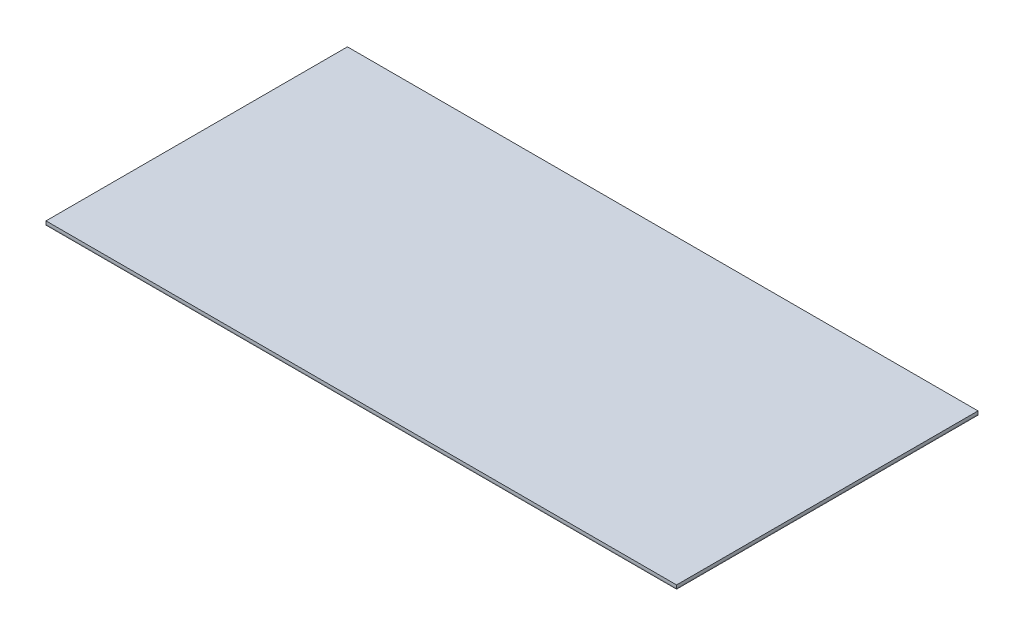
ISO-10303-21;
HEADER;
FILE_DESCRIPTION(('STEP AP214'),'2;1');
FILE_NAME('part.step','',(''),(''),'','','');
FILE_SCHEMA(('AUTOMOTIVE_DESIGN { 1 0 10303 214 1 1 1 1 }'));
ENDSEC;
DATA;
#1=APPLICATION_CONTEXT('core data for automotive mechanical design processes');
#2=APPLICATION_PROTOCOL_DEFINITION('international standard','automotive_design',2000,#1);
#3=PRODUCT_CONTEXT('',#1,'mechanical');
#4=PRODUCT('Part','Part','',(#3));
#5=PRODUCT_RELATED_PRODUCT_CATEGORY('part','',(#4));
#6=PRODUCT_DEFINITION_FORMATION('','',#4);
#7=PRODUCT_DEFINITION_CONTEXT('part definition',#1,'design');
#8=PRODUCT_DEFINITION('design','',#6,#7);
#9=PRODUCT_DEFINITION_SHAPE('','',#8);
#10=(LENGTH_UNIT() NAMED_UNIT(*) SI_UNIT(.MILLI.,.METRE.));
#11=(NAMED_UNIT(*) PLANE_ANGLE_UNIT() SI_UNIT($,.RADIAN.));
#12=(NAMED_UNIT(*) SI_UNIT($,.STERADIAN.) SOLID_ANGLE_UNIT());
#13=UNCERTAINTY_MEASURE_WITH_UNIT(LENGTH_MEASURE(1.E-05),#10,'distance_accuracy_value','');
#14=(GEOMETRIC_REPRESENTATION_CONTEXT(3) GLOBAL_UNCERTAINTY_ASSIGNED_CONTEXT((#13)) GLOBAL_UNIT_ASSIGNED_CONTEXT((#10,
#11,#12)) REPRESENTATION_CONTEXT('',''));
#15=CARTESIAN_POINT('',(0.,0.,0.));
#16=DIRECTION('',(0.,0.,1.));
#17=DIRECTION('',(1.,0.,0.));
#18=AXIS2_PLACEMENT_3D('',#15,#16,#17);
#19=CARTESIAN_POINT('',(1025.,-2.,490.));
#20=DIRECTION('',(0.,0.,-1.));
#21=DIRECTION('',(-1.,0.,0.));
#22=AXIS2_PLACEMENT_3D('',#19,#20,#21);
#23=PLANE('',#22);
#24=DIRECTION('',(-1.,0.,0.));
#25=VECTOR('',#24,1.);
#26=CARTESIAN_POINT('',(1025.,0.,490.));
#27=LINE('',#26,#25);
#28=CARTESIAN_POINT('',(1025.,0.,490.));
#29=VERTEX_POINT('',#28);
#30=CARTESIAN_POINT('',(-1025.,0.,490.));
#31=VERTEX_POINT('',#30);
#32=EDGE_CURVE('E105',#29,#31,#27,.T.);
#33=ORIENTED_EDGE('',*,*,#32,.T.);
#34=DIRECTION('',(0.,1.,0.));
#35=VECTOR('',#34,1.);
#36=CARTESIAN_POINT('',(-1025.,-2.,490.));
#37=LINE('',#36,#35);
#38=CARTESIAN_POINT('',(-1025.,-2.,490.));
#39=VERTEX_POINT('',#38);
#40=EDGE_CURVE('E12',#39,#31,#37,.T.);
#41=ORIENTED_EDGE('',*,*,#40,.F.);
#42=DIRECTION('',(-1.,0.,0.));
#43=VECTOR('',#42,1.);
#44=CARTESIAN_POINT('',(1025.,-2.,490.));
#45=LINE('',#44,#43);
#46=CARTESIAN_POINT('',(1025.,-2.,490.));
#47=VERTEX_POINT('',#46);
#48=EDGE_CURVE('E93',#47,#39,#45,.T.);
#49=ORIENTED_EDGE('',*,*,#48,.F.);
#50=DIRECTION('',(0.,1.,0.));
#51=VECTOR('',#50,1.);
#52=CARTESIAN_POINT('',(1025.,-2.,490.));
#53=LINE('',#52,#51);
#54=EDGE_CURVE('E101',#47,#29,#53,.T.);
#55=ORIENTED_EDGE('',*,*,#54,.T.);
#56=EDGE_LOOP('',(#33,#41,#49,#55));
#57=FACE_BOUND('',#56,.T.);
#58=ADVANCED_FACE('F42',(#57),#23,.F.);
#59=CARTESIAN_POINT('',(-1025.,-2.,490.));
#60=DIRECTION('',(1.,0.,0.));
#61=DIRECTION('',(0.,0.,-1.));
#62=AXIS2_PLACEMENT_3D('',#59,#60,#61);
#63=PLANE('',#62);
#64=DIRECTION('',(0.,0.,-1.));
#65=VECTOR('',#64,1.);
#66=CARTESIAN_POINT('',(-1025.,0.,490.));
#67=LINE('',#66,#65);
#68=CARTESIAN_POINT('',(-1025.,0.,-490.));
#69=VERTEX_POINT('',#68);
#70=EDGE_CURVE('E97',#31,#69,#67,.T.);
#71=ORIENTED_EDGE('',*,*,#70,.T.);
#72=DIRECTION('',(0.,1.,0.));
#73=VECTOR('',#72,1.);
#74=CARTESIAN_POINT('',(-1025.,-2.,-490.));
#75=LINE('',#74,#73);
#76=CARTESIAN_POINT('',(-1025.,-2.,-490.));
#77=VERTEX_POINT('',#76);
#78=EDGE_CURVE('E50',#77,#69,#75,.T.);
#79=ORIENTED_EDGE('',*,*,#78,.F.);
#80=DIRECTION('',(0.,0.,-1.));
#81=VECTOR('',#80,1.);
#82=CARTESIAN_POINT('',(-1025.,-2.,490.));
#83=LINE('',#82,#81);
#84=EDGE_CURVE('E88',#39,#77,#83,.T.);
#85=ORIENTED_EDGE('',*,*,#84,.F.);
#86=ORIENTED_EDGE('',*,*,#40,.T.);
#87=EDGE_LOOP('',(#71,#79,#85,#86));
#88=FACE_BOUND('',#87,.T.);
#89=ADVANCED_FACE('F96',(#88),#63,.F.);
#90=CARTESIAN_POINT('',(-1025.,-2.,-490.));
#91=DIRECTION('',(0.,0.,1.));
#92=DIRECTION('',(1.,0.,0.));
#93=AXIS2_PLACEMENT_3D('',#90,#91,#92);
#94=PLANE('',#93);
#95=DIRECTION('',(1.,0.,0.));
#96=VECTOR('',#95,1.);
#97=CARTESIAN_POINT('',(-1025.,0.,-490.));
#98=LINE('',#97,#96);
#99=CARTESIAN_POINT('',(1025.,0.,-490.));
#100=VERTEX_POINT('',#99);
#101=EDGE_CURVE('E75',#69,#100,#98,.T.);
#102=ORIENTED_EDGE('',*,*,#101,.T.);
#103=DIRECTION('',(0.,1.,0.));
#104=VECTOR('',#103,1.);
#105=CARTESIAN_POINT('',(1025.,-2.,-490.));
#106=LINE('',#105,#104);
#107=CARTESIAN_POINT('',(1025.,-2.,-490.));
#108=VERTEX_POINT('',#107);
#109=EDGE_CURVE('E98',#108,#100,#106,.T.);
#110=ORIENTED_EDGE('',*,*,#109,.F.);
#111=DIRECTION('',(1.,0.,0.));
#112=VECTOR('',#111,1.);
#113=CARTESIAN_POINT('',(-1025.,-2.,-490.));
#114=LINE('',#113,#112);
#115=EDGE_CURVE('E91',#77,#108,#114,.T.);
#116=ORIENTED_EDGE('',*,*,#115,.F.);
#117=ORIENTED_EDGE('',*,*,#78,.T.);
#118=EDGE_LOOP('',(#102,#110,#116,#117));
#119=FACE_BOUND('',#118,.T.);
#120=ADVANCED_FACE('F99',(#119),#94,.F.);
#121=CARTESIAN_POINT('',(1025.,-2.,-490.));
#122=DIRECTION('',(-1.,0.,0.));
#123=DIRECTION('',(0.,0.,1.));
#124=AXIS2_PLACEMENT_3D('',#121,#122,#123);
#125=PLANE('',#124);
#126=DIRECTION('',(0.,0.,1.));
#127=VECTOR('',#126,1.);
#128=CARTESIAN_POINT('',(1025.,0.,-490.));
#129=LINE('',#128,#127);
#130=EDGE_CURVE('E81',#100,#29,#129,.T.);
#131=ORIENTED_EDGE('',*,*,#130,.T.);
#132=ORIENTED_EDGE('',*,*,#54,.F.);
#133=DIRECTION('',(0.,0.,1.));
#134=VECTOR('',#133,1.);
#135=CARTESIAN_POINT('',(1025.,-2.,-490.));
#136=LINE('',#135,#134);
#137=EDGE_CURVE('E58',#108,#47,#136,.T.);
#138=ORIENTED_EDGE('',*,*,#137,.F.);
#139=ORIENTED_EDGE('',*,*,#109,.T.);
#140=EDGE_LOOP('',(#131,#132,#138,#139));
#141=FACE_BOUND('',#140,.T.);
#142=ADVANCED_FACE('F112',(#141),#125,.F.);
#143=CARTESIAN_POINT('',(-1025.,-2.,490.));
#144=DIRECTION('',(0.,-1.,0.));
#145=DIRECTION('',(0.,0.,-1.));
#146=AXIS2_PLACEMENT_3D('',#143,#144,#145);
#147=PLANE('',#146);
#148=ORIENTED_EDGE('',*,*,#48,.T.);
#149=ORIENTED_EDGE('',*,*,#84,.T.);
#150=ORIENTED_EDGE('',*,*,#115,.T.);
#151=ORIENTED_EDGE('',*,*,#137,.T.);
#152=EDGE_LOOP('',(#148,#149,#150,#151));
#153=FACE_BOUND('',#152,.T.);
#154=ADVANCED_FACE('F89',(#153),#147,.T.);
#155=CARTESIAN_POINT('',(-1025.,0.,490.));
#156=DIRECTION('',(0.,-1.,0.));
#157=DIRECTION('',(0.,0.,-1.));
#158=AXIS2_PLACEMENT_3D('',#155,#156,#157);
#159=PLANE('',#158);
#160=ORIENTED_EDGE('',*,*,#32,.F.);
#161=ORIENTED_EDGE('',*,*,#130,.F.);
#162=ORIENTED_EDGE('',*,*,#101,.F.);
#163=ORIENTED_EDGE('',*,*,#70,.F.);
#164=EDGE_LOOP('',(#160,#161,#162,#163));
#165=FACE_BOUND('',#164,.T.);
#166=ADVANCED_FACE('F115',(#165),#159,.F.);
#167=CLOSED_SHELL('',(#58,#89,#120,#142,#154,#166));
#168=MANIFOLD_SOLID_BREP('B2',#167);
#169=CARTESIAN_POINT('',(-1025.,10.,490.));
#170=DIRECTION('',(1.,0.,0.));
#171=DIRECTION('',(0.,0.,-1.));
#172=AXIS2_PLACEMENT_3D('',#169,#170,#171);
#173=PLANE('',#172);
#174=DIRECTION('',(0.,0.,1.));
#175=VECTOR('',#174,1.);
#176=CARTESIAN_POINT('',(-1025.,0.,490.));
#177=LINE('',#176,#175);
#178=CARTESIAN_POINT('',(-1025.,0.,-490.));
#179=VERTEX_POINT('',#178);
#180=CARTESIAN_POINT('',(-1025.,0.,490.));
#181=VERTEX_POINT('',#180);
#182=EDGE_CURVE('E228',#179,#181,#177,.T.);
#183=ORIENTED_EDGE('',*,*,#182,.T.);
#184=DIRECTION('',(0.,-1.,0.));
#185=VECTOR('',#184,1.);
#186=CARTESIAN_POINT('',(-1025.,10.,490.));
#187=LINE('',#186,#185);
#188=CARTESIAN_POINT('',(-1025.,10.,490.));
#189=VERTEX_POINT('',#188);
#190=EDGE_CURVE('E40',#189,#181,#187,.T.);
#191=ORIENTED_EDGE('',*,*,#190,.F.);
#192=DIRECTION('',(0.,0.,1.));
#193=VECTOR('',#192,1.);
#194=CARTESIAN_POINT('',(-1025.,10.,490.));
#195=LINE('',#194,#193);
#196=CARTESIAN_POINT('',(-1025.,10.,-490.));
#197=VERTEX_POINT('',#196);
#198=EDGE_CURVE('E216',#197,#189,#195,.T.);
#199=ORIENTED_EDGE('',*,*,#198,.F.);
#200=DIRECTION('',(0.,-1.,0.));
#201=VECTOR('',#200,1.);
#202=CARTESIAN_POINT('',(-1025.,10.,-490.));
#203=LINE('',#202,#201);
#204=EDGE_CURVE('E224',#197,#179,#203,.T.);
#205=ORIENTED_EDGE('',*,*,#204,.T.);
#206=EDGE_LOOP('',(#183,#191,#199,#205));
#207=FACE_BOUND('',#206,.T.);
#208=ADVANCED_FACE('F165',(#207),#173,.F.);
#209=CARTESIAN_POINT('',(1025.,10.,490.));
#210=DIRECTION('',(0.,0.,-1.));
#211=DIRECTION('',(-1.,0.,0.));
#212=AXIS2_PLACEMENT_3D('',#209,#210,#211);
#213=PLANE('',#212);
#214=DIRECTION('',(1.,0.,0.));
#215=VECTOR('',#214,1.);
#216=CARTESIAN_POINT('',(1025.,0.,490.));
#217=LINE('',#216,#215);
#218=CARTESIAN_POINT('',(1025.,0.,490.));
#219=VERTEX_POINT('',#218);
#220=EDGE_CURVE('E220',#181,#219,#217,.T.);
#221=ORIENTED_EDGE('',*,*,#220,.T.);
#222=DIRECTION('',(0.,-1.,0.));
#223=VECTOR('',#222,1.);
#224=CARTESIAN_POINT('',(1025.,10.,490.));
#225=LINE('',#224,#223);
#226=CARTESIAN_POINT('',(1025.,10.,490.));
#227=VERTEX_POINT('',#226);
#228=EDGE_CURVE('E173',#227,#219,#225,.T.);
#229=ORIENTED_EDGE('',*,*,#228,.F.);
#230=DIRECTION('',(1.,0.,0.));
#231=VECTOR('',#230,1.);
#232=CARTESIAN_POINT('',(1025.,10.,490.));
#233=LINE('',#232,#231);
#234=EDGE_CURVE('E211',#189,#227,#233,.T.);
#235=ORIENTED_EDGE('',*,*,#234,.F.);
#236=ORIENTED_EDGE('',*,*,#190,.T.);
#237=EDGE_LOOP('',(#221,#229,#235,#236));
#238=FACE_BOUND('',#237,.T.);
#239=ADVANCED_FACE('F219',(#238),#213,.F.);
#240=CARTESIAN_POINT('',(1025.,10.,490.));
#241=DIRECTION('',(-1.,0.,0.));
#242=DIRECTION('',(0.,0.,1.));
#243=AXIS2_PLACEMENT_3D('',#240,#241,#242);
#244=PLANE('',#243);
#245=DIRECTION('',(0.,0.,-1.));
#246=VECTOR('',#245,1.);
#247=CARTESIAN_POINT('',(1025.,0.,490.));
#248=LINE('',#247,#246);
#249=CARTESIAN_POINT('',(1025.,0.,-490.));
#250=VERTEX_POINT('',#249);
#251=EDGE_CURVE('E198',#219,#250,#248,.T.);
#252=ORIENTED_EDGE('',*,*,#251,.T.);
#253=DIRECTION('',(0.,-1.,0.));
#254=VECTOR('',#253,1.);
#255=CARTESIAN_POINT('',(1025.,10.,-490.));
#256=LINE('',#255,#254);
#257=CARTESIAN_POINT('',(1025.,10.,-490.));
#258=VERTEX_POINT('',#257);
#259=EDGE_CURVE('E221',#258,#250,#256,.T.);
#260=ORIENTED_EDGE('',*,*,#259,.F.);
#261=DIRECTION('',(0.,0.,-1.));
#262=VECTOR('',#261,1.);
#263=CARTESIAN_POINT('',(1025.,10.,490.));
#264=LINE('',#263,#262);
#265=EDGE_CURVE('E214',#227,#258,#264,.T.);
#266=ORIENTED_EDGE('',*,*,#265,.F.);
#267=ORIENTED_EDGE('',*,*,#228,.T.);
#268=EDGE_LOOP('',(#252,#260,#266,#267));
#269=FACE_BOUND('',#268,.T.);
#270=ADVANCED_FACE('F222',(#269),#244,.F.);
#271=CARTESIAN_POINT('',(1025.,10.,-490.));
#272=DIRECTION('',(0.,0.,1.));
#273=DIRECTION('',(1.,0.,0.));
#274=AXIS2_PLACEMENT_3D('',#271,#272,#273);
#275=PLANE('',#274);
#276=DIRECTION('',(-1.,0.,0.));
#277=VECTOR('',#276,1.);
#278=CARTESIAN_POINT('',(1025.,0.,-490.));
#279=LINE('',#278,#277);
#280=EDGE_CURVE('E204',#250,#179,#279,.T.);
#281=ORIENTED_EDGE('',*,*,#280,.T.);
#282=ORIENTED_EDGE('',*,*,#204,.F.);
#283=DIRECTION('',(-1.,0.,0.));
#284=VECTOR('',#283,1.);
#285=CARTESIAN_POINT('',(1025.,10.,-490.));
#286=LINE('',#285,#284);
#287=EDGE_CURVE('E181',#258,#197,#286,.T.);
#288=ORIENTED_EDGE('',*,*,#287,.F.);
#289=ORIENTED_EDGE('',*,*,#259,.T.);
#290=EDGE_LOOP('',(#281,#282,#288,#289));
#291=FACE_BOUND('',#290,.T.);
#292=ADVANCED_FACE('F235',(#291),#275,.F.);
#293=CARTESIAN_POINT('',(-1025.,10.,-490.));
#294=DIRECTION('',(0.,1.,0.));
#295=DIRECTION('',(0.,0.,1.));
#296=AXIS2_PLACEMENT_3D('',#293,#294,#295);
#297=PLANE('',#296);
#298=ORIENTED_EDGE('',*,*,#198,.T.);
#299=ORIENTED_EDGE('',*,*,#234,.T.);
#300=ORIENTED_EDGE('',*,*,#265,.T.);
#301=ORIENTED_EDGE('',*,*,#287,.T.);
#302=EDGE_LOOP('',(#298,#299,#300,#301));
#303=FACE_BOUND('',#302,.T.);
#304=ADVANCED_FACE('F212',(#303),#297,.T.);
#305=CARTESIAN_POINT('',(-1025.,0.,-490.));
#306=DIRECTION('',(0.,1.,0.));
#307=DIRECTION('',(0.,0.,1.));
#308=AXIS2_PLACEMENT_3D('',#305,#306,#307);
#309=PLANE('',#308);
#310=ORIENTED_EDGE('',*,*,#182,.F.);
#311=ORIENTED_EDGE('',*,*,#280,.F.);
#312=ORIENTED_EDGE('',*,*,#251,.F.);
#313=ORIENTED_EDGE('',*,*,#220,.F.);
#314=EDGE_LOOP('',(#310,#311,#312,#313));
#315=FACE_BOUND('',#314,.T.);
#316=ADVANCED_FACE('F238',(#315),#309,.F.);
#317=CLOSED_SHELL('',(#208,#239,#270,#292,#304,#316));
#318=MANIFOLD_SOLID_BREP('B6',#317);
#319=ADVANCED_BREP_SHAPE_REPRESENTATION('',(#18,#168,#318),#14);
#320=SHAPE_DEFINITION_REPRESENTATION(#9,#319);
ENDSEC;
END-ISO-10303-21;
